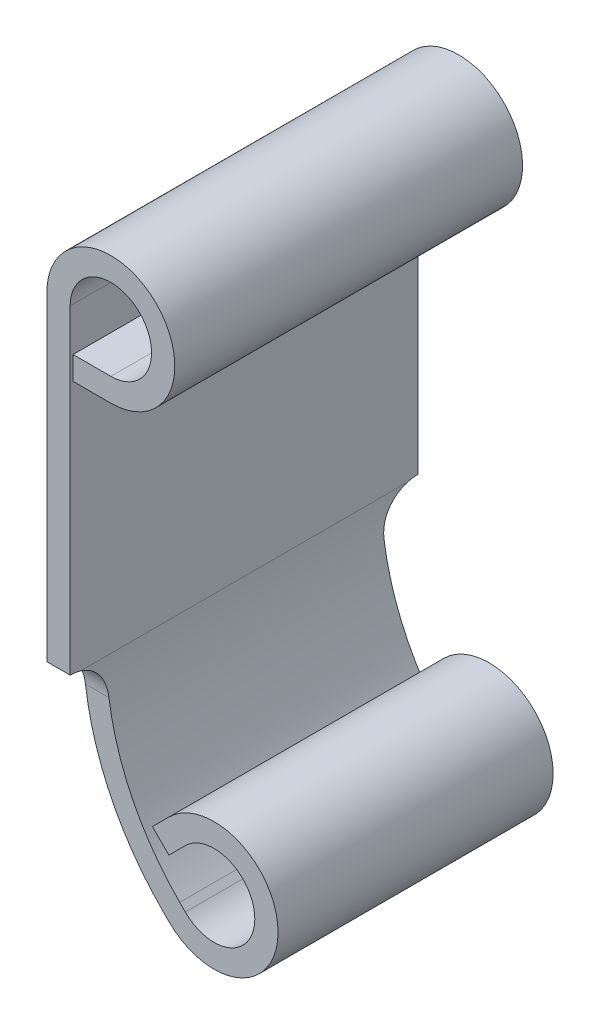
ISO-10303-21;
HEADER;
FILE_DESCRIPTION(('STEP AP214'),'2;1');
FILE_NAME('part.step','',(''),(''),'','','');
FILE_SCHEMA(('AUTOMOTIVE_DESIGN { 1 0 10303 214 1 1 1 1 }'));
ENDSEC;
DATA;
#1=APPLICATION_CONTEXT('core data for automotive mechanical design processes');
#2=APPLICATION_PROTOCOL_DEFINITION('international standard','automotive_design',2000,#1);
#3=PRODUCT_CONTEXT('',#1,'mechanical');
#4=PRODUCT('Part','Part','',(#3));
#5=PRODUCT_RELATED_PRODUCT_CATEGORY('part','',(#4));
#6=PRODUCT_DEFINITION_FORMATION('','',#4);
#7=PRODUCT_DEFINITION_CONTEXT('part definition',#1,'design');
#8=PRODUCT_DEFINITION('design','',#6,#7);
#9=PRODUCT_DEFINITION_SHAPE('','',#8);
#10=(LENGTH_UNIT() NAMED_UNIT(*) SI_UNIT(.MILLI.,.METRE.));
#11=(NAMED_UNIT(*) PLANE_ANGLE_UNIT() SI_UNIT($,.RADIAN.));
#12=(NAMED_UNIT(*) SI_UNIT($,.STERADIAN.) SOLID_ANGLE_UNIT());
#13=UNCERTAINTY_MEASURE_WITH_UNIT(LENGTH_MEASURE(1.E-05),#10,'distance_accuracy_value','');
#14=(GEOMETRIC_REPRESENTATION_CONTEXT(3) GLOBAL_UNCERTAINTY_ASSIGNED_CONTEXT((#13)) GLOBAL_UNIT_ASSIGNED_CONTEXT((#10,
#11,#12)) REPRESENTATION_CONTEXT('',''));
#15=CARTESIAN_POINT('',(0.,0.,0.));
#16=DIRECTION('',(0.,0.,1.));
#17=DIRECTION('',(1.,0.,0.));
#18=AXIS2_PLACEMENT_3D('',#15,#16,#17);
#19=CARTESIAN_POINT('',(-3.29999999999999,-33.4819394424174,-5.98));
#20=DIRECTION('',(0.,0.,1.));
#21=DIRECTION('',(1.,0.,0.));
#22=AXIS2_PLACEMENT_3D('',#19,#20,#21);
#23=PLANE('',#22);
#24=DIRECTION('',(1.,0.,0.));
#25=VECTOR('',#24,1.);
#26=CARTESIAN_POINT('',(-3.29999999999998,-42.2819394424174,-5.98));
#27=LINE('',#26,#25);
#28=CARTESIAN_POINT('',(-5.49999999999998,-42.2819394424174,-5.98));
#29=VERTEX_POINT('',#28);
#30=CARTESIAN_POINT('',(-4.69999999999999,-42.2819394424174,-5.98));
#31=VERTEX_POINT('',#30);
#32=EDGE_CURVE('E186',#29,#31,#27,.T.);
#33=ORIENTED_EDGE('',*,*,#32,.F.);
#34=DIRECTION('',(0.,-1.,0.));
#35=VECTOR('',#34,1.);
#36=CARTESIAN_POINT('',(-5.49999999999998,-31.2819394424174,-5.98));
#37=LINE('',#36,#35);
#38=CARTESIAN_POINT('',(-5.49999999999998,-31.2819394424174,-5.98));
#39=VERTEX_POINT('',#38);
#40=EDGE_CURVE('E490',#39,#29,#37,.T.);
#41=ORIENTED_EDGE('',*,*,#40,.F.);
#42=CARTESIAN_POINT('',(-3.3,-31.2819394424174,-5.98));
#43=DIRECTION('',(0.,0.,1.));
#44=DIRECTION('',(1.,0.,0.));
#45=AXIS2_PLACEMENT_3D('',#42,#43,#44);
#46=CIRCLE('',#45,2.19999999999999);
#47=CARTESIAN_POINT('',(-3.29999999999999,-33.4819394424174,-5.98));
#48=VERTEX_POINT('',#47);
#49=EDGE_CURVE('E577',#48,#39,#46,.T.);
#50=ORIENTED_EDGE('',*,*,#49,.F.);
#51=DIRECTION('',(-1.,0.,0.));
#52=VECTOR('',#51,1.);
#53=CARTESIAN_POINT('',(-3.29999999999999,-33.4819394424174,-5.98));
#54=LINE('',#53,#52);
#55=CARTESIAN_POINT('',(-4.59999999999999,-33.4819394424174,-5.98));
#56=VERTEX_POINT('',#55);
#57=EDGE_CURVE('E554',#48,#56,#54,.T.);
#58=ORIENTED_EDGE('',*,*,#57,.T.);
#59=DIRECTION('',(0.,1.,0.));
#60=VECTOR('',#59,1.);
#61=CARTESIAN_POINT('',(-4.59999999999999,-33.4819394424174,-5.98));
#62=LINE('',#61,#60);
#63=CARTESIAN_POINT('',(-4.60000000000001,-32.6819394424174,-5.98));
#64=VERTEX_POINT('',#63);
#65=EDGE_CURVE('E546',#56,#64,#62,.T.);
#66=ORIENTED_EDGE('',*,*,#65,.T.);
#67=DIRECTION('',(-1.,0.,0.));
#68=VECTOR('',#67,1.);
#69=CARTESIAN_POINT('',(-3.3,-32.6819394424174,-5.98));
#70=LINE('',#69,#68);
#71=CARTESIAN_POINT('',(-3.3,-32.6819394424174,-5.98));
#72=VERTEX_POINT('',#71);
#73=EDGE_CURVE('E570',#72,#64,#70,.T.);
#74=ORIENTED_EDGE('',*,*,#73,.F.);
#75=CARTESIAN_POINT('',(-3.3,-31.2819394424174,-5.98));
#76=DIRECTION('',(0.,0.,1.));
#77=DIRECTION('',(1.,0.,0.));
#78=AXIS2_PLACEMENT_3D('',#75,#76,#77);
#79=CIRCLE('',#78,1.39999999999999);
#80=CARTESIAN_POINT('',(-4.69999999999999,-31.2819394424174,-5.98));
#81=VERTEX_POINT('',#80);
#82=EDGE_CURVE('E189',#72,#81,#79,.T.);
#83=ORIENTED_EDGE('',*,*,#82,.T.);
#84=DIRECTION('',(0.,-1.,0.));
#85=VECTOR('',#84,1.);
#86=CARTESIAN_POINT('',(-4.69999999999999,-31.2819394424174,-5.98));
#87=LINE('',#86,#85);
#88=EDGE_CURVE('E175',#81,#31,#87,.T.);
#89=ORIENTED_EDGE('',*,*,#88,.T.);
#90=EDGE_LOOP('',(#33,#41,#50,#58,#66,#74,#83,#89));
#91=FACE_BOUND('',#90,.T.);
#92=ADVANCED_FACE('F31',(#91),#23,.F.);
#93=CARTESIAN_POINT('',(-1.98873016277921,-46.6276248673667,-5.98));
#94=DIRECTION('',(0.707106781186547,-0.707106781186548,0.));
#95=DIRECTION('',(0.707106781186548,0.707106781186547,0.));
#96=AXIS2_PLACEMENT_3D('',#93,#94,#95);
#97=PLANE('',#96);
#98=DIRECTION('',(-0.707106781186548,-0.707106781186547,0.));
#99=VECTOR('',#98,1.);
#100=CARTESIAN_POINT('',(-1.98873016277921,-46.6276248673667,-4.73));
#101=LINE('',#100,#99);
#102=CARTESIAN_POINT('',(-1.98873016277921,-46.6276248673667,-4.73));
#103=VERTEX_POINT('',#102);
#104=CARTESIAN_POINT('',(-2.55441558772845,-47.1933102923159,-4.73));
#105=VERTEX_POINT('',#104);
#106=EDGE_CURVE('E609',#103,#105,#101,.T.);
#107=ORIENTED_EDGE('',*,*,#106,.F.);
#108=DIRECTION('',(0.,0.,1.));
#109=VECTOR('',#108,1.);
#110=CARTESIAN_POINT('',(-1.98873016277921,-46.6276248673667,-5.98));
#111=LINE('',#110,#109);
#112=CARTESIAN_POINT('',(-1.98873016277921,-46.6276248673667,4.73));
#113=VERTEX_POINT('',#112);
#114=EDGE_CURVE('E506',#103,#113,#111,.T.);
#115=ORIENTED_EDGE('',*,*,#114,.T.);
#116=DIRECTION('',(-0.707106781186548,-0.707106781186547,0.));
#117=VECTOR('',#116,1.);
#118=CARTESIAN_POINT('',(-1.98873016277921,-46.6276248673667,4.73));
#119=LINE('',#118,#117);
#120=CARTESIAN_POINT('',(-2.55441558772845,-47.1933102923159,4.73));
#121=VERTEX_POINT('',#120);
#122=EDGE_CURVE('E521',#113,#121,#119,.T.);
#123=ORIENTED_EDGE('',*,*,#122,.T.);
#124=DIRECTION('',(0.,0.,1.));
#125=VECTOR('',#124,1.);
#126=CARTESIAN_POINT('',(-2.55441558772845,-47.1933102923159,-5.98));
#127=LINE('',#126,#125);
#128=EDGE_CURVE('E510',#105,#121,#127,.T.);
#129=ORIENTED_EDGE('',*,*,#128,.F.);
#130=EDGE_LOOP('',(#107,#115,#123,#129));
#131=FACE_BOUND('',#130,.T.);
#132=ADVANCED_FACE('F226',(#131),#97,.T.);
#133=CARTESIAN_POINT('',(-2.55441558772847,-46.0619394424175,-5.98));
#134=DIRECTION('',(0.707106781186547,-0.707106781186548,0.));
#135=DIRECTION('',(0.707106781186548,0.707106781186547,0.));
#136=AXIS2_PLACEMENT_3D('',#133,#134,#135);
#137=PLANE('',#136);
#138=DIRECTION('',(0.,0.,1.));
#139=VECTOR('',#138,1.);
#140=CARTESIAN_POINT('',(-2.55441558772847,-46.0619394424175,-5.98));
#141=LINE('',#140,#139);
#142=CARTESIAN_POINT('',(-2.55441558772847,-46.0619394424175,-4.73));
#143=VERTEX_POINT('',#142);
#144=CARTESIAN_POINT('',(-2.55441558772847,-46.0619394424175,4.73));
#145=VERTEX_POINT('',#144);
#146=EDGE_CURVE('E504',#143,#145,#141,.T.);
#147=ORIENTED_EDGE('',*,*,#146,.F.);
#148=DIRECTION('',(-0.707106781186548,-0.707106781186547,0.));
#149=VECTOR('',#148,1.);
#150=CARTESIAN_POINT('',(-2.55441558772847,-46.0619394424175,-4.73));
#151=LINE('',#150,#149);
#152=CARTESIAN_POINT('',(-3.1201010126777,-46.6276248673667,-4.73));
#153=VERTEX_POINT('',#152);
#154=EDGE_CURVE('E611',#143,#153,#151,.T.);
#155=ORIENTED_EDGE('',*,*,#154,.T.);
#156=DIRECTION('',(0.,0.,1.));
#157=VECTOR('',#156,1.);
#158=CARTESIAN_POINT('',(-3.12010101267771,-46.6276248673667,-5.98));
#159=LINE('',#158,#157);
#160=CARTESIAN_POINT('',(-3.12010101267771,-46.6276248673667,4.73));
#161=VERTEX_POINT('',#160);
#162=EDGE_CURVE('E508',#153,#161,#159,.T.);
#163=ORIENTED_EDGE('',*,*,#162,.T.);
#164=DIRECTION('',(-0.707106781186548,-0.707106781186547,0.));
#165=VECTOR('',#164,1.);
#166=CARTESIAN_POINT('',(-2.55441558772847,-46.0619394424175,4.73));
#167=LINE('',#166,#165);
#168=EDGE_CURVE('E525',#145,#161,#167,.T.);
#169=ORIENTED_EDGE('',*,*,#168,.F.);
#170=EDGE_LOOP('',(#147,#155,#163,#169));
#171=FACE_BOUND('',#170,.T.);
#172=ADVANCED_FACE('F230',(#171),#137,.F.);
#173=CARTESIAN_POINT('',(-0.998780669118026,-47.6175743610278,0.));
#174=DIRECTION('',(0.,0.,1.));
#175=DIRECTION('',(1.,0.,0.));
#176=AXIS2_PLACEMENT_3D('',#173,#174,#175);
#177=CYLINDRICAL_SURFACE('',#176,1.39999999999999);
#178=CARTESIAN_POINT('',(-0.998780669118026,-47.6175743610278,-4.73));
#179=DIRECTION('',(0.,0.,1.));
#180=DIRECTION('',(1.,0.,0.));
#181=AXIS2_PLACEMENT_3D('',#178,#179,#180);
#182=CIRCLE('',#181,1.39999999999999);
#183=CARTESIAN_POINT('',(-1.98873016277917,-48.607523854689,-4.73));
#184=VERTEX_POINT('',#183);
#185=EDGE_CURVE('E604',#184,#103,#182,.T.);
#186=ORIENTED_EDGE('',*,*,#185,.F.);
#187=DIRECTION('',(0.,0.,1.));
#188=VECTOR('',#187,1.);
#189=CARTESIAN_POINT('',(-1.98873016277917,-48.607523854689,-5.98));
#190=LINE('',#189,#188);
#191=CARTESIAN_POINT('',(-1.98873016277917,-48.607523854689,4.73));
#192=VERTEX_POINT('',#191);
#193=EDGE_CURVE('E502',#184,#192,#190,.T.);
#194=ORIENTED_EDGE('',*,*,#193,.T.);
#195=CARTESIAN_POINT('',(-0.998780669118026,-47.6175743610278,4.73));
#196=DIRECTION('',(0.,0.,1.));
#197=DIRECTION('',(0.,-1.,0.));
#198=AXIS2_PLACEMENT_3D('',#195,#196,#197);
#199=CIRCLE('',#198,1.39999999999999);
#200=EDGE_CURVE('E530',#192,#113,#199,.T.);
#201=ORIENTED_EDGE('',*,*,#200,.T.);
#202=ORIENTED_EDGE('',*,*,#114,.F.);
#203=EDGE_LOOP('',(#186,#194,#201,#202));
#204=FACE_BOUND('',#203,.T.);
#205=ADVANCED_FACE('F234',(#204),#177,.F.);
#206=CARTESIAN_POINT('',(-0.998780669118026,-47.6175743610278,0.));
#207=DIRECTION('',(0.,0.,1.));
#208=DIRECTION('',(1.,0.,0.));
#209=AXIS2_PLACEMENT_3D('',#206,#207,#208);
#210=CYLINDRICAL_SURFACE('',#209,2.19999999999999);
#211=DIRECTION('',(0.,0.,1.));
#212=VECTOR('',#211,1.);
#213=CARTESIAN_POINT('',(-2.55441558772839,-49.1732092796382,-5.98));
#214=LINE('',#213,#212);
#215=CARTESIAN_POINT('',(-2.55441558772839,-49.1732092796382,-4.73));
#216=VERTEX_POINT('',#215);
#217=CARTESIAN_POINT('',(-2.55441558772839,-49.1732092796382,4.73));
#218=VERTEX_POINT('',#217);
#219=EDGE_CURVE('E500',#216,#218,#214,.T.);
#220=ORIENTED_EDGE('',*,*,#219,.F.);
#221=CARTESIAN_POINT('',(-0.998780669118026,-47.6175743610278,-4.73));
#222=DIRECTION('',(0.,0.,1.));
#223=DIRECTION('',(1.,0.,0.));
#224=AXIS2_PLACEMENT_3D('',#221,#222,#223);
#225=CIRCLE('',#224,2.19999999999999);
#226=EDGE_CURVE('E606',#216,#143,#225,.T.);
#227=ORIENTED_EDGE('',*,*,#226,.T.);
#228=ORIENTED_EDGE('',*,*,#146,.T.);
#229=CARTESIAN_POINT('',(-0.998780669118026,-47.6175743610278,4.73));
#230=DIRECTION('',(0.,0.,1.));
#231=DIRECTION('',(0.,-1.,0.));
#232=AXIS2_PLACEMENT_3D('',#229,#230,#231);
#233=CIRCLE('',#232,2.19999999999999);
#234=EDGE_CURVE('E528',#218,#145,#233,.T.);
#235=ORIENTED_EDGE('',*,*,#234,.F.);
#236=EDGE_LOOP('',(#220,#227,#228,#235));
#237=FACE_BOUND('',#236,.T.);
#238=ADVANCED_FACE('F238',(#237),#210,.T.);
#239=CARTESIAN_POINT('',(-2.18111831820427,-48.4151356992639,-5.98));
#240=DIRECTION('',(0.707106781186568,0.707106781186528,0.));
#241=DIRECTION('',(-0.707106781186528,0.707106781186568,0.));
#242=AXIS2_PLACEMENT_3D('',#239,#240,#241);
#243=PLANE('',#242);
#244=DIRECTION('',(0.707106781186528,-0.707106781186568,0.));
#245=VECTOR('',#244,1.);
#246=CARTESIAN_POINT('',(-2.18111831820427,-48.4151356992639,-4.73));
#247=LINE('',#246,#245);
#248=CARTESIAN_POINT('',(-2.18111831820427,-48.4151356992639,-4.73));
#249=VERTEX_POINT('',#248);
#250=EDGE_CURVE('E599',#249,#184,#247,.T.);
#251=ORIENTED_EDGE('',*,*,#250,.F.);
#252=DIRECTION('',(0.,0.,1.));
#253=VECTOR('',#252,1.);
#254=CARTESIAN_POINT('',(-2.18111831820427,-48.4151356992639,-5.98));
#255=LINE('',#254,#253);
#256=CARTESIAN_POINT('',(-2.18111831820427,-48.4151356992639,4.73));
#257=VERTEX_POINT('',#256);
#258=EDGE_CURVE('E497',#249,#257,#255,.T.);
#259=ORIENTED_EDGE('',*,*,#258,.T.);
#260=DIRECTION('',(0.707106781186528,-0.707106781186568,0.));
#261=VECTOR('',#260,1.);
#262=CARTESIAN_POINT('',(-2.18111831820428,-48.4151356992639,4.73));
#263=LINE('',#262,#261);
#264=EDGE_CURVE('E540',#257,#192,#263,.T.);
#265=ORIENTED_EDGE('',*,*,#264,.T.);
#266=ORIENTED_EDGE('',*,*,#193,.F.);
#267=EDGE_LOOP('',(#251,#259,#265,#266));
#268=FACE_BOUND('',#267,.T.);
#269=ADVANCED_FACE('F242',(#268),#243,.T.);
#270=CARTESIAN_POINT('',(-2.7468037431535,-48.9808211242131,-5.98));
#271=DIRECTION('',(0.707106781186568,0.707106781186528,0.));
#272=DIRECTION('',(-0.707106781186528,0.707106781186568,0.));
#273=AXIS2_PLACEMENT_3D('',#270,#271,#272);
#274=PLANE('',#273);
#275=DIRECTION('',(0.,0.,1.));
#276=VECTOR('',#275,1.);
#277=CARTESIAN_POINT('',(-2.7468037431535,-48.9808211242131,-5.98));
#278=LINE('',#277,#276);
#279=CARTESIAN_POINT('',(-2.7468037431535,-48.9808211242131,-4.73));
#280=VERTEX_POINT('',#279);
#281=CARTESIAN_POINT('',(-2.7468037431535,-48.9808211242131,4.73));
#282=VERTEX_POINT('',#281);
#283=EDGE_CURVE('E190',#280,#282,#278,.T.);
#284=ORIENTED_EDGE('',*,*,#283,.F.);
#285=DIRECTION('',(0.707106781186528,-0.707106781186568,0.));
#286=VECTOR('',#285,1.);
#287=CARTESIAN_POINT('',(-2.7468037431535,-48.9808211242131,-4.73));
#288=LINE('',#287,#286);
#289=EDGE_CURVE('E597',#280,#216,#288,.T.);
#290=ORIENTED_EDGE('',*,*,#289,.T.);
#291=ORIENTED_EDGE('',*,*,#219,.T.);
#292=DIRECTION('',(0.707106781186528,-0.707106781186568,0.));
#293=VECTOR('',#292,1.);
#294=CARTESIAN_POINT('',(-2.7468037431535,-48.9808211242131,4.73));
#295=LINE('',#294,#293);
#296=EDGE_CURVE('E537',#282,#218,#295,.T.);
#297=ORIENTED_EDGE('',*,*,#296,.F.);
#298=EDGE_LOOP('',(#284,#290,#291,#297));
#299=FACE_BOUND('',#298,.T.);
#300=ADVANCED_FACE('F246',(#299),#274,.F.);
#301=CARTESIAN_POINT('',(3.9,-42.3340173810595,0.));
#302=DIRECTION('',(0.,0.,1.));
#303=DIRECTION('',(1.,0.,0.));
#304=AXIS2_PLACEMENT_3D('',#301,#302,#303);
#305=CYLINDRICAL_SURFACE('',#304,8.59999999999999);
#306=CARTESIAN_POINT('',(3.9,-42.3340173810595,-4.73));
#307=DIRECTION('',(0.,0.,1.));
#308=DIRECTION('',(1.,0.,0.));
#309=AXIS2_PLACEMENT_3D('',#306,#307,#308);
#310=CIRCLE('',#309,8.59999999999999);
#311=CARTESIAN_POINT('',(-4.61616009331153,-43.5319394424174,-4.73));
#312=VERTEX_POINT('',#311);
#313=EDGE_CURVE('E532',#312,#249,#310,.T.);
#314=ORIENTED_EDGE('',*,*,#313,.F.);
#315=CARTESIAN_POINT('',(-4.61616009331153,-43.5319394424174,-4.73));
#316=CARTESIAN_POINT('',(-4.62104993828591,-43.4971852873352,-4.73000021214259));
#317=CARTESIAN_POINT('',(-4.62572227706097,-43.4624164564649,-4.73145041955103));
#318=CARTESIAN_POINT('',(-4.63461435122024,-43.3930629631632,-4.73725079006692));
#319=CARTESIAN_POINT('',(-4.63883407938238,-43.3584783036789,-4.74160099944015));
#320=CARTESIAN_POINT('',(-4.65077731516905,-43.2554124747046,-4.75898633879174));
#321=CARTESIAN_POINT('',(-4.65779775424165,-43.187527437024,-4.77635619077868));
#322=CARTESIAN_POINT('',(-4.6699448542798,-43.0554464215857,-4.82226392659528));
#323=CARTESIAN_POINT('',(-4.6750701442369,-42.9912531427982,-4.85080986492932));
#324=CARTESIAN_POINT('',(-4.68359707255082,-42.8684776225537,-4.91829367252971));
#325=CARTESIAN_POINT('',(-4.6869993582717,-42.8098932804362,-4.95722763042071));
#326=CARTESIAN_POINT('',(-4.69237109550727,-42.7002998997159,-5.04418593573854));
#327=CARTESIAN_POINT('',(-4.69434721760826,-42.6492564940415,-5.09216662117558));
#328=CARTESIAN_POINT('',(-4.697265264186,-42.5558632785398,-5.19600367389916));
#329=CARTESIAN_POINT('',(-4.69820706749208,-42.5135144877609,-5.25186096306681));
#330=CARTESIAN_POINT('',(-4.69933397685407,-42.4454181480997,-5.35930387979101));
#331=CARTESIAN_POINT('',(-4.6996240667332,-42.4180568840554,-5.40987518833364));
#332=CARTESIAN_POINT('',(-4.69995342039199,-42.3705362908953,-5.51423151939748));
#333=CARTESIAN_POINT('',(-4.6999929457928,-42.3503694706436,-5.56801313068863));
#334=CARTESIAN_POINT('',(-4.69999999999999,-42.3340173810602,-5.62295275534797));
#335=B_SPLINE_CURVE_WITH_KNOTS('',3,(#315,#316,#317,#318,#319,#320,#321,#322,#323,#324,#325,
#326,#327,#328,#329,#330,#331,#332,#333,#334),.UNSPECIFIED.,.F.,.F.,(4,2,2,2,2,2,2,2,2,4),(0.,
0.105226819044401,0.210455316886367,0.420637092755744,0.6309706243947,0.841225071158929,
1.05048960765263,1.25977865691849,1.4317487489792,1.60353925280753),.UNSPECIFIED.);
#336=CARTESIAN_POINT('',(-4.69999999999998,-42.3340173810596,-5.62295275534758));
#337=VERTEX_POINT('',#336);
#338=EDGE_CURVE('E181',#312,#337,#335,.T.);
#339=ORIENTED_EDGE('',*,*,#338,.T.);
#340=DIRECTION('',(0.,0.,1.));
#341=VECTOR('',#340,1.);
#342=CARTESIAN_POINT('',(-4.69999999999998,-42.3340173810596,-5.98));
#343=LINE('',#342,#341);
#344=CARTESIAN_POINT('',(-4.69999999999998,-42.3340173810596,5.62295275534758));
#345=VERTEX_POINT('',#344);
#346=EDGE_CURVE('E50',#337,#345,#343,.T.);
#347=ORIENTED_EDGE('',*,*,#346,.T.);
#348=CARTESIAN_POINT('',(-4.69999999999998,-42.3340173810596,5.62295275534758));
#349=CARTESIAN_POINT('',(-4.69999896984181,-42.3440467758353,5.58930420985432));
#350=CARTESIAN_POINT('',(-4.69998251217419,-42.3554895365009,5.55609443730486));
#351=CARTESIAN_POINT('',(-4.69988076492231,-42.3811254798105,5.49075558258808));
#352=CARTESIAN_POINT('',(-4.69979547786382,-42.3953185615146,5.45862646081037));
#353=CARTESIAN_POINT('',(-4.69937974929133,-42.4418722934562,5.36423774400827));
#354=CARTESIAN_POINT('',(-4.69888962241867,-42.4782322191111,5.30389391881556));
#355=CARTESIAN_POINT('',(-4.69711417848655,-42.560549455515,5.19016566730561));
#356=CARTESIAN_POINT('',(-4.69582847246832,-42.6065114534336,5.1367846605771));
#357=CARTESIAN_POINT('',(-4.69206697346365,-42.7066978430134,5.03851480547164));
#358=CARTESIAN_POINT('',(-4.68959165274193,-42.7609189500643,4.99362259697612));
#359=CARTESIAN_POINT('',(-4.68310356340903,-42.8758980705384,4.91369757916631));
#360=CARTESIAN_POINT('',(-4.67909482262628,-42.9366386610743,4.87863935363578));
#361=CARTESIAN_POINT('',(-4.66928046649219,-43.0630210319571,4.81918525274701));
#362=CARTESIAN_POINT('',(-4.66347462571153,-43.128663426405,4.79479071597494));
#363=CARTESIAN_POINT('',(-4.65119581265196,-43.2505734646554,4.76074929495946));
#364=CARTESIAN_POINT('',(-4.64503966721363,-43.3063567627667,4.74921989334364));
#365=CARTESIAN_POINT('',(-4.63150561562947,-43.4187635781341,4.73383791464321));
#366=CARTESIAN_POINT('',(-4.62412904968312,-43.475386112367,4.7299769762937));
#367=CARTESIAN_POINT('',(-4.61616009331153,-43.5319394424174,4.73));
#368=B_SPLINE_CURVE_WITH_KNOTS('',3,(#348,#349,#350,#351,#352,#353,#354,#355,#356,#357,#358,
#359,#360,#361,#362,#363,#364,#365,#366,#367),.UNSPECIFIED.,.F.,.F.,(4,2,2,2,2,2,2,2,2,4),(0.,
0.105269772666643,0.210535682538854,0.420811278703959,0.631189759952247,0.841484792025171,
1.0512311945167,1.26100391839391,1.43236495028479,1.60353903686256),.UNSPECIFIED.);
#369=CARTESIAN_POINT('',(-4.61616009331153,-43.5319394424174,4.73));
#370=VERTEX_POINT('',#369);
#371=EDGE_CURVE('E12',#345,#370,#368,.T.);
#372=ORIENTED_EDGE('',*,*,#371,.T.);
#373=CARTESIAN_POINT('',(3.9,-42.3340173810595,4.73));
#374=DIRECTION('',(0.,0.,1.));
#375=DIRECTION('',(0.,-1.,0.));
#376=AXIS2_PLACEMENT_3D('',#373,#374,#375);
#377=CIRCLE('',#376,8.59999999999999);
#378=EDGE_CURVE('E544',#370,#257,#377,.T.);
#379=ORIENTED_EDGE('',*,*,#378,.T.);
#380=ORIENTED_EDGE('',*,*,#258,.F.);
#381=EDGE_LOOP('',(#314,#339,#347,#372,#379,#380));
#382=FACE_BOUND('',#381,.T.);
#383=ADVANCED_FACE('F249',(#382),#305,.F.);
#384=CARTESIAN_POINT('',(3.9,-42.3340173810595,0.));
#385=DIRECTION('',(0.,0.,1.));
#386=DIRECTION('',(1.,0.,0.));
#387=AXIS2_PLACEMENT_3D('',#384,#385,#386);
#388=CYLINDRICAL_SURFACE('',#387,9.39999999999998);
#389=DIRECTION('',(0.,0.,1.));
#390=VECTOR('',#389,1.);
#391=CARTESIAN_POINT('',(-5.49999999999998,-42.3340173810596,-5.98));
#392=LINE('',#391,#390);
#393=CARTESIAN_POINT('',(-5.49999999999998,-42.3340173810596,-5.62295275534751));
#394=VERTEX_POINT('',#393);
#395=CARTESIAN_POINT('',(-5.49999999999998,-42.3340173810596,5.62295275534751));
#396=VERTEX_POINT('',#395);
#397=EDGE_CURVE('E58',#394,#396,#392,.T.);
#398=ORIENTED_EDGE('',*,*,#397,.F.);
#399=CARTESIAN_POINT('',(-5.49999999999998,-42.3340173810596,-5.62295275534751));
#400=CARTESIAN_POINT('',(-5.49999905661126,-42.3440492392555,-5.58929594034764));
#401=CARTESIAN_POINT('',(-5.49998399261306,-42.3554951589282,-5.55607811827434));
#402=CARTESIAN_POINT('',(-5.49989085168055,-42.3811387355255,-5.49072379004687));
#403=CARTESIAN_POINT('',(-5.49981277716354,-42.3953362868727,-5.45858724246079));
#404=CARTESIAN_POINT('',(-5.49943220214168,-42.4419042762644,-5.36417943813982));
#405=CARTESIAN_POINT('',(-5.49898352145647,-42.4782755327428,-5.30382482024347));
#406=CARTESIAN_POINT('',(-5.49735821704836,-42.5606193692811,-5.19007836269852));
#407=CARTESIAN_POINT('',(-5.49618124675229,-42.6065965136176,-5.13668985268583));
#408=CARTESIAN_POINT('',(-5.4927378632681,-42.7068208609449,-5.03840552678773));
#409=CARTESIAN_POINT('',(-5.4904718579031,-42.7610649629272,-4.99350654049893));
#410=CARTESIAN_POINT('',(-5.48453098034495,-42.8761284357806,-4.91355202379635));
#411=CARTESIAN_POINT('',(-5.48085916842797,-42.936933319541,-4.87847539643718));
#412=CARTESIAN_POINT('',(-5.47186858540614,-43.0634684352975,-4.81900026254848));
#413=CARTESIAN_POINT('',(-5.46654964501703,-43.1291991730236,-4.79460285420213));
#414=CARTESIAN_POINT('',(-5.45531832048159,-43.2510920432886,-4.76063596632717));
#415=CARTESIAN_POINT('',(-5.4497007832698,-43.3067572973084,-4.74915153432201));
#416=CARTESIAN_POINT('',(-5.43735346990106,-43.4189468300615,-4.73382650215751));
#417=CARTESIAN_POINT('',(-5.43062490670433,-43.4754701115989,-4.72997762488849));
#418=CARTESIAN_POINT('',(-5.42335683833412,-43.5319394424174,-4.73));
#419=B_SPLINE_CURVE_WITH_KNOTS('',3,(#399,#400,#401,#402,#403,#404,#405,#406,#407,#408,#409,
#410,#411,#412,#413,#414,#415,#416,#417,#418),.UNSPECIFIED.,.F.,.F.,(4,2,2,2,2,2,2,2,2,4),(0.,
0.105295616912872,0.210587194538839,0.420906951999539,0.631326871952451,0.841668054936537,
1.05155392958767,1.26146138250427,1.43228914775261,1.60293163052857),.UNSPECIFIED.);
#420=CARTESIAN_POINT('',(-5.42335683833413,-43.5319394424174,-4.73));
#421=VERTEX_POINT('',#420);
#422=EDGE_CURVE('E210',#394,#421,#419,.T.);
#423=ORIENTED_EDGE('',*,*,#422,.T.);
#424=CARTESIAN_POINT('',(3.9,-42.3340173810595,-4.73));
#425=DIRECTION('',(0.,0.,1.));
#426=DIRECTION('',(1.,0.,0.));
#427=AXIS2_PLACEMENT_3D('',#424,#425,#426);
#428=CIRCLE('',#427,9.39999999999998);
#429=EDGE_CURVE('E594',#421,#280,#428,.T.);
#430=ORIENTED_EDGE('',*,*,#429,.T.);
#431=ORIENTED_EDGE('',*,*,#283,.T.);
#432=CARTESIAN_POINT('',(3.9,-42.3340173810595,4.73));
#433=DIRECTION('',(0.,0.,1.));
#434=DIRECTION('',(0.,-1.,0.));
#435=AXIS2_PLACEMENT_3D('',#432,#433,#434);
#436=CIRCLE('',#435,9.39999999999998);
#437=CARTESIAN_POINT('',(-5.42335683833413,-43.5319394424174,4.73));
#438=VERTEX_POINT('',#437);
#439=EDGE_CURVE('E482',#438,#282,#436,.T.);
#440=ORIENTED_EDGE('',*,*,#439,.F.);
#441=CARTESIAN_POINT('',(-5.42335683833413,-43.5319394424174,4.73));
#442=CARTESIAN_POINT('',(-5.42783194279368,-43.4971183204976,4.73000021631504));
#443=CARTESIAN_POINT('',(-5.43210757519307,-43.462287637918,4.73145600064782));
#444=CARTESIAN_POINT('',(-5.44024381151267,-43.3928213550807,4.73727622324138));
#445=CARTESIAN_POINT('',(-5.4441044130131,-43.3581857559615,4.74164067845971));
#446=CARTESIAN_POINT('',(-5.45502979369463,-43.2549849007542,4.75907785904926));
#447=CARTESIAN_POINT('',(-5.46145011232919,-43.1870320164946,4.77649442339107));
#448=CARTESIAN_POINT('',(-5.47255598999336,-43.0548564167103,4.82250330879005));
#449=CARTESIAN_POINT('',(-5.47724038136731,-42.9906362363487,4.85110312568028));
#450=CARTESIAN_POINT('',(-5.48503204479835,-42.8678326591938,4.91869442688992));
#451=CARTESIAN_POINT('',(-5.48813987877363,-42.8092472600879,4.95768220115544));
#452=CARTESIAN_POINT('',(-5.4930472350131,-42.6996267131875,5.04477858255361));
#453=CARTESIAN_POINT('',(-5.49485184290047,-42.6485628421595,5.09285080169649));
#454=CARTESIAN_POINT('',(-5.49751472850571,-42.5551571622251,5.19687708299666));
#455=CARTESIAN_POINT('',(-5.49837291569745,-42.5128161879876,5.2528318985553));
#456=CARTESIAN_POINT('',(-5.49939621676439,-42.444902930324,5.36022598304194));
#457=CARTESIAN_POINT('',(-5.49965910538936,-42.4176810277151,5.41063105009592));
#458=CARTESIAN_POINT('',(-5.49995769400112,-42.3703881535428,5.51462735494816));
#459=CARTESIAN_POINT('',(-5.49999363113441,-42.3503097383119,5.5682152078428));
#460=CARTESIAN_POINT('',(-5.49999999999998,-42.3340173810602,5.6229527553479));
#461=B_SPLINE_CURVE_WITH_KNOTS('',3,(#441,#442,#443,#444,#445,#446,#447,#448,#449,#450,#451,
#452,#453,#454,#455,#456,#457,#458,#459,#460),.UNSPECIFIED.,.F.,.F.,(4,2,2,2,2,2,2,2,2,4),(0.,
0.105259590519127,0.210519794707271,0.420760789105645,0.631142944605037,0.841450062705028,
1.0509319910769,1.26043395487489,1.43177242978033,1.60293183976006),.UNSPECIFIED.);
#462=EDGE_CURVE('E180',#438,#396,#461,.T.);
#463=ORIENTED_EDGE('',*,*,#462,.T.);
#464=EDGE_LOOP('',(#398,#423,#430,#431,#440,#463));
#465=FACE_BOUND('',#464,.T.);
#466=ADVANCED_FACE('F219',(#465),#388,.T.);
#467=CARTESIAN_POINT('',(-4.69999999999999,-31.2819394424174,-5.98));
#468=DIRECTION('',(1.,0.,0.));
#469=DIRECTION('',(0.,1.,0.));
#470=AXIS2_PLACEMENT_3D('',#467,#468,#469);
#471=PLANE('',#470);
#472=ORIENTED_EDGE('',*,*,#346,.F.);
#473=CARTESIAN_POINT('',(-4.69999999999998,-43.5319394424174,-5.98));
#474=DIRECTION('',(1.,0.,0.));
#475=DIRECTION('',(0.,1.,0.));
#476=AXIS2_PLACEMENT_3D('',#473,#474,#475);
#477=CIRCLE('',#476,1.25);
#478=EDGE_CURVE('E171',#337,#31,#477,.F.);
#479=ORIENTED_EDGE('',*,*,#478,.T.);
#480=ORIENTED_EDGE('',*,*,#88,.F.);
#481=DIRECTION('',(0.,0.,1.));
#482=VECTOR('',#481,1.);
#483=CARTESIAN_POINT('',(-4.69999999999999,-31.2819394424174,-5.98));
#484=LINE('',#483,#482);
#485=CARTESIAN_POINT('',(-4.69999999999999,-31.2819394424174,5.98));
#486=VERTEX_POINT('',#485);
#487=EDGE_CURVE('E575',#81,#486,#484,.T.);
#488=ORIENTED_EDGE('',*,*,#487,.T.);
#489=DIRECTION('',(0.,-1.,0.));
#490=VECTOR('',#489,1.);
#491=CARTESIAN_POINT('',(-4.69999999999999,-31.2819394424174,5.98));
#492=LINE('',#491,#490);
#493=CARTESIAN_POINT('',(-4.69999999999999,-42.2819394424174,5.98));
#494=VERTEX_POINT('',#493);
#495=EDGE_CURVE('E191',#486,#494,#492,.T.);
#496=ORIENTED_EDGE('',*,*,#495,.T.);
#497=CARTESIAN_POINT('',(-4.69999999999998,-43.5319394424174,5.98));
#498=DIRECTION('',(1.,0.,0.));
#499=DIRECTION('',(0.,1.,0.));
#500=AXIS2_PLACEMENT_3D('',#497,#498,#499);
#501=CIRCLE('',#500,1.25);
#502=EDGE_CURVE('E44',#494,#345,#501,.F.);
#503=ORIENTED_EDGE('',*,*,#502,.T.);
#504=EDGE_LOOP('',(#472,#479,#480,#488,#496,#503));
#505=FACE_BOUND('',#504,.T.);
#506=ADVANCED_FACE('F173',(#505),#471,.T.);
#507=CARTESIAN_POINT('',(-5.49999999999998,-31.2819394424174,-5.98));
#508=DIRECTION('',(1.,0.,0.));
#509=DIRECTION('',(0.,1.,0.));
#510=AXIS2_PLACEMENT_3D('',#507,#508,#509);
#511=PLANE('',#510);
#512=ORIENTED_EDGE('',*,*,#40,.T.);
#513=CARTESIAN_POINT('',(-5.49999999999998,-43.5319394424174,-5.98));
#514=DIRECTION('',(1.,0.,0.));
#515=DIRECTION('',(0.,1.,0.));
#516=AXIS2_PLACEMENT_3D('',#513,#514,#515);
#517=CIRCLE('',#516,1.25);
#518=EDGE_CURVE('E195',#29,#394,#517,.T.);
#519=ORIENTED_EDGE('',*,*,#518,.T.);
#520=ORIENTED_EDGE('',*,*,#397,.T.);
#521=CARTESIAN_POINT('',(-5.49999999999998,-43.5319394424174,5.98));
#522=DIRECTION('',(1.,0.,0.));
#523=DIRECTION('',(0.,1.,0.));
#524=AXIS2_PLACEMENT_3D('',#521,#522,#523);
#525=CIRCLE('',#524,1.25);
#526=CARTESIAN_POINT('',(-5.49999999999998,-42.2819394424174,5.98));
#527=VERTEX_POINT('',#526);
#528=EDGE_CURVE('E474',#396,#527,#525,.T.);
#529=ORIENTED_EDGE('',*,*,#528,.T.);
#530=DIRECTION('',(0.,-1.,0.));
#531=VECTOR('',#530,1.);
#532=CARTESIAN_POINT('',(-5.49999999999998,-31.2819394424174,5.98));
#533=LINE('',#532,#531);
#534=CARTESIAN_POINT('',(-5.49999999999998,-31.2819394424174,5.98));
#535=VERTEX_POINT('',#534);
#536=EDGE_CURVE('E485',#535,#527,#533,.T.);
#537=ORIENTED_EDGE('',*,*,#536,.F.);
#538=DIRECTION('',(0.,0.,1.));
#539=VECTOR('',#538,1.);
#540=CARTESIAN_POINT('',(-5.49999999999998,-31.2819394424174,-5.98));
#541=LINE('',#540,#539);
#542=EDGE_CURVE('E573',#39,#535,#541,.T.);
#543=ORIENTED_EDGE('',*,*,#542,.F.);
#544=EDGE_LOOP('',(#512,#519,#520,#529,#537,#543));
#545=FACE_BOUND('',#544,.T.);
#546=ADVANCED_FACE('F276',(#545),#511,.F.);
#547=CARTESIAN_POINT('',(-3.29999999999999,-33.4819394424174,5.98));
#548=DIRECTION('',(0.,0.,1.));
#549=DIRECTION('',(1.,0.,0.));
#550=AXIS2_PLACEMENT_3D('',#547,#548,#549);
#551=PLANE('',#550);
#552=ORIENTED_EDGE('',*,*,#536,.T.);
#553=DIRECTION('',(1.,0.,0.));
#554=VECTOR('',#553,1.);
#555=CARTESIAN_POINT('',(-3.29999999999998,-42.2819394424174,5.98));
#556=LINE('',#555,#554);
#557=EDGE_CURVE('E197',#527,#494,#556,.T.);
#558=ORIENTED_EDGE('',*,*,#557,.T.);
#559=ORIENTED_EDGE('',*,*,#495,.F.);
#560=CARTESIAN_POINT('',(-3.3,-31.2819394424174,5.98));
#561=DIRECTION('',(0.,0.,1.));
#562=DIRECTION('',(1.,0.,0.));
#563=AXIS2_PLACEMENT_3D('',#560,#561,#562);
#564=CIRCLE('',#563,1.39999999999999);
#565=CARTESIAN_POINT('',(-3.3,-32.6819394424174,5.98));
#566=VERTEX_POINT('',#565);
#567=EDGE_CURVE('E581',#566,#486,#564,.T.);
#568=ORIENTED_EDGE('',*,*,#567,.F.);
#569=DIRECTION('',(-1.,0.,0.));
#570=VECTOR('',#569,1.);
#571=CARTESIAN_POINT('',(-3.3,-32.6819394424174,5.98));
#572=LINE('',#571,#570);
#573=CARTESIAN_POINT('',(-4.60000000000001,-32.6819394424174,5.98));
#574=VERTEX_POINT('',#573);
#575=EDGE_CURVE('E568',#566,#574,#572,.T.);
#576=ORIENTED_EDGE('',*,*,#575,.T.);
#577=DIRECTION('',(0.,1.,0.));
#578=VECTOR('',#577,1.);
#579=CARTESIAN_POINT('',(-4.59999999999999,-33.4819394424174,5.98));
#580=LINE('',#579,#578);
#581=CARTESIAN_POINT('',(-4.59999999999999,-33.4819394424174,5.98));
#582=VERTEX_POINT('',#581);
#583=EDGE_CURVE('E560',#582,#574,#580,.T.);
#584=ORIENTED_EDGE('',*,*,#583,.F.);
#585=DIRECTION('',(-1.,0.,0.));
#586=VECTOR('',#585,1.);
#587=CARTESIAN_POINT('',(-3.29999999999999,-33.4819394424174,5.98));
#588=LINE('',#587,#586);
#589=CARTESIAN_POINT('',(-3.29999999999999,-33.4819394424174,5.98));
#590=VERTEX_POINT('',#589);
#591=EDGE_CURVE('E566',#590,#582,#588,.T.);
#592=ORIENTED_EDGE('',*,*,#591,.F.);
#593=CARTESIAN_POINT('',(-3.3,-31.2819394424174,5.98));
#594=DIRECTION('',(0.,0.,1.));
#595=DIRECTION('',(1.,0.,0.));
#596=AXIS2_PLACEMENT_3D('',#593,#594,#595);
#597=CIRCLE('',#596,2.19999999999999);
#598=EDGE_CURVE('E489',#590,#535,#597,.T.);
#599=ORIENTED_EDGE('',*,*,#598,.T.);
#600=EDGE_LOOP('',(#552,#558,#559,#568,#576,#584,#592,#599));
#601=FACE_BOUND('',#600,.T.);
#602=ADVANCED_FACE('F278',(#601),#551,.T.);
#603=CARTESIAN_POINT('',(-2.55441558772845,-47.1933102923159,-5.98));
#604=DIRECTION('',(-0.707106781186525,-0.70710678118657,0.));
#605=DIRECTION('',(0.70710678118657,-0.707106781186525,0.));
#606=AXIS2_PLACEMENT_3D('',#603,#604,#605);
#607=PLANE('',#606);
#608=DIRECTION('',(-0.70710678118657,0.707106781186525,0.));
#609=VECTOR('',#608,1.);
#610=CARTESIAN_POINT('',(-2.55441558772845,-47.1933102923159,-4.73));
#611=LINE('',#610,#609);
#612=EDGE_CURVE('E196',#105,#153,#611,.T.);
#613=ORIENTED_EDGE('',*,*,#612,.F.);
#614=ORIENTED_EDGE('',*,*,#128,.T.);
#615=DIRECTION('',(-0.70710678118657,0.707106781186525,0.));
#616=VECTOR('',#615,1.);
#617=CARTESIAN_POINT('',(-2.55441558772845,-47.1933102923159,4.73));
#618=LINE('',#617,#616);
#619=EDGE_CURVE('E201',#121,#161,#618,.T.);
#620=ORIENTED_EDGE('',*,*,#619,.T.);
#621=ORIENTED_EDGE('',*,*,#162,.F.);
#622=EDGE_LOOP('',(#613,#614,#620,#621));
#623=FACE_BOUND('',#622,.T.);
#624=ADVANCED_FACE('F274',(#623),#607,.T.);
#625=CARTESIAN_POINT('',(-3.3,-31.2819394424174,0.));
#626=DIRECTION('',(0.,0.,1.));
#627=DIRECTION('',(1.,0.,0.));
#628=AXIS2_PLACEMENT_3D('',#625,#626,#627);
#629=CYLINDRICAL_SURFACE('',#628,1.39999999999999);
#630=DIRECTION('',(0.,0.,1.));
#631=VECTOR('',#630,1.);
#632=CARTESIAN_POINT('',(-3.3,-32.6819394424174,-5.98));
#633=LINE('',#632,#631);
#634=EDGE_CURVE('E547',#72,#566,#633,.T.);
#635=ORIENTED_EDGE('',*,*,#634,.T.);
#636=ORIENTED_EDGE('',*,*,#567,.T.);
#637=ORIENTED_EDGE('',*,*,#487,.F.);
#638=ORIENTED_EDGE('',*,*,#82,.F.);
#639=EDGE_LOOP('',(#635,#636,#637,#638));
#640=FACE_BOUND('',#639,.T.);
#641=ADVANCED_FACE('F270',(#640),#629,.F.);
#642=CARTESIAN_POINT('',(-3.3,-31.2819394424174,0.));
#643=DIRECTION('',(0.,0.,1.));
#644=DIRECTION('',(1.,0.,0.));
#645=AXIS2_PLACEMENT_3D('',#642,#643,#644);
#646=CYLINDRICAL_SURFACE('',#645,2.19999999999999);
#647=DIRECTION('',(0.,0.,1.));
#648=VECTOR('',#647,1.);
#649=CARTESIAN_POINT('',(-3.29999999999999,-33.4819394424174,-5.98));
#650=LINE('',#649,#648);
#651=EDGE_CURVE('E550',#48,#590,#650,.T.);
#652=ORIENTED_EDGE('',*,*,#651,.F.);
#653=ORIENTED_EDGE('',*,*,#49,.T.);
#654=ORIENTED_EDGE('',*,*,#542,.T.);
#655=ORIENTED_EDGE('',*,*,#598,.F.);
#656=EDGE_LOOP('',(#652,#653,#654,#655));
#657=FACE_BOUND('',#656,.T.);
#658=ADVANCED_FACE('F267',(#657),#646,.T.);
#659=CARTESIAN_POINT('',(-3.3,-32.6819394424174,-5.98));
#660=DIRECTION('',(0.,-1.,0.));
#661=DIRECTION('',(1.,0.,0.));
#662=AXIS2_PLACEMENT_3D('',#659,#660,#661);
#663=PLANE('',#662);
#664=DIRECTION('',(0.,0.,1.));
#665=VECTOR('',#664,1.);
#666=CARTESIAN_POINT('',(-4.60000000000001,-32.6819394424174,-5.98));
#667=LINE('',#666,#665);
#668=EDGE_CURVE('E557',#64,#574,#667,.T.);
#669=ORIENTED_EDGE('',*,*,#668,.T.);
#670=ORIENTED_EDGE('',*,*,#575,.F.);
#671=ORIENTED_EDGE('',*,*,#634,.F.);
#672=ORIENTED_EDGE('',*,*,#73,.T.);
#673=EDGE_LOOP('',(#669,#670,#671,#672));
#674=FACE_BOUND('',#673,.T.);
#675=ADVANCED_FACE('F265',(#674),#663,.F.);
#676=CARTESIAN_POINT('',(-3.29999999999999,-33.4819394424174,-5.98));
#677=DIRECTION('',(0.,-1.,0.));
#678=DIRECTION('',(1.,0.,0.));
#679=AXIS2_PLACEMENT_3D('',#676,#677,#678);
#680=PLANE('',#679);
#681=DIRECTION('',(0.,0.,1.));
#682=VECTOR('',#681,1.);
#683=CARTESIAN_POINT('',(-4.59999999999999,-33.4819394424174,-5.98));
#684=LINE('',#683,#682);
#685=EDGE_CURVE('E551',#56,#582,#684,.T.);
#686=ORIENTED_EDGE('',*,*,#685,.F.);
#687=ORIENTED_EDGE('',*,*,#57,.F.);
#688=ORIENTED_EDGE('',*,*,#651,.T.);
#689=ORIENTED_EDGE('',*,*,#591,.T.);
#690=EDGE_LOOP('',(#686,#687,#688,#689));
#691=FACE_BOUND('',#690,.T.);
#692=ADVANCED_FACE('F317',(#691),#680,.T.);
#693=CARTESIAN_POINT('',(-4.60000000000001,-32.6819394424174,-5.98));
#694=DIRECTION('',(1.,0.,0.));
#695=DIRECTION('',(0.,1.,0.));
#696=AXIS2_PLACEMENT_3D('',#693,#694,#695);
#697=PLANE('',#696);
#698=ORIENTED_EDGE('',*,*,#65,.F.);
#699=ORIENTED_EDGE('',*,*,#685,.T.);
#700=ORIENTED_EDGE('',*,*,#583,.T.);
#701=ORIENTED_EDGE('',*,*,#668,.F.);
#702=EDGE_LOOP('',(#698,#699,#700,#701));
#703=FACE_BOUND('',#702,.T.);
#704=ADVANCED_FACE('F324',(#703),#697,.F.);
#705=CARTESIAN_POINT('',(4.50000000000003,-61.3247478109278,4.73000000000001));
#706=DIRECTION('',(0.,0.,1.));
#707=DIRECTION('',(0.,-1.,0.));
#708=AXIS2_PLACEMENT_3D('',#705,#706,#707);
#709=PLANE('',#708);
#710=ORIENTED_EDGE('',*,*,#378,.F.);
#711=DIRECTION('',(-1.,0.,0.));
#712=VECTOR('',#711,1.);
#713=CARTESIAN_POINT('',(-5.49999999999998,-43.5319394424174,4.73));
#714=LINE('',#713,#712);
#715=EDGE_CURVE('E206',#370,#438,#714,.T.);
#716=ORIENTED_EDGE('',*,*,#715,.T.);
#717=ORIENTED_EDGE('',*,*,#439,.T.);
#718=ORIENTED_EDGE('',*,*,#296,.T.);
#719=ORIENTED_EDGE('',*,*,#234,.T.);
#720=ORIENTED_EDGE('',*,*,#168,.T.);
#721=ORIENTED_EDGE('',*,*,#619,.F.);
#722=ORIENTED_EDGE('',*,*,#122,.F.);
#723=ORIENTED_EDGE('',*,*,#200,.F.);
#724=ORIENTED_EDGE('',*,*,#264,.F.);
#725=EDGE_LOOP('',(#710,#716,#717,#718,#719,#720,#721,#722,#723,#724));
#726=FACE_BOUND('',#725,.T.);
#727=ADVANCED_FACE('F332',(#726),#709,.T.);
#728=CARTESIAN_POINT('',(4.50000000000003,-61.3247478109278,-4.73));
#729=DIRECTION('',(0.,0.,1.));
#730=DIRECTION('',(1.,0.,0.));
#731=AXIS2_PLACEMENT_3D('',#728,#729,#730);
#732=PLANE('',#731);
#733=ORIENTED_EDGE('',*,*,#429,.F.);
#734=DIRECTION('',(-1.,0.,0.));
#735=VECTOR('',#734,1.);
#736=CARTESIAN_POINT('',(4.50000000000002,-43.5319394424174,-4.73));
#737=LINE('',#736,#735);
#738=EDGE_CURVE('E199',#421,#312,#737,.F.);
#739=ORIENTED_EDGE('',*,*,#738,.T.);
#740=ORIENTED_EDGE('',*,*,#313,.T.);
#741=ORIENTED_EDGE('',*,*,#250,.T.);
#742=ORIENTED_EDGE('',*,*,#185,.T.);
#743=ORIENTED_EDGE('',*,*,#106,.T.);
#744=ORIENTED_EDGE('',*,*,#612,.T.);
#745=ORIENTED_EDGE('',*,*,#154,.F.);
#746=ORIENTED_EDGE('',*,*,#226,.F.);
#747=ORIENTED_EDGE('',*,*,#289,.F.);
#748=EDGE_LOOP('',(#733,#739,#740,#741,#742,#743,#744,#745,#746,#747));
#749=FACE_BOUND('',#748,.T.);
#750=ADVANCED_FACE('F225',(#749),#732,.F.);
#751=CARTESIAN_POINT('',(4.50000000000002,-43.5319394424174,-5.98));
#752=DIRECTION('',(-1.,0.,0.));
#753=DIRECTION('',(0.,-1.,0.));
#754=AXIS2_PLACEMENT_3D('',#751,#752,#753);
#755=CYLINDRICAL_SURFACE('',#754,1.25);
#756=ORIENTED_EDGE('',*,*,#338,.F.);
#757=ORIENTED_EDGE('',*,*,#738,.F.);
#758=ORIENTED_EDGE('',*,*,#422,.F.);
#759=ORIENTED_EDGE('',*,*,#518,.F.);
#760=ORIENTED_EDGE('',*,*,#32,.T.);
#761=ORIENTED_EDGE('',*,*,#478,.F.);
#762=EDGE_LOOP('',(#756,#757,#758,#759,#760,#761));
#763=FACE_BOUND('',#762,.T.);
#764=ADVANCED_FACE('F193',(#763),#755,.F.);
#765=CARTESIAN_POINT('',(4.50000000000002,-43.5319394424174,5.98));
#766=DIRECTION('',(1.,0.,0.));
#767=DIRECTION('',(0.,1.,0.));
#768=AXIS2_PLACEMENT_3D('',#765,#766,#767);
#769=CYLINDRICAL_SURFACE('',#768,1.25);
#770=ORIENTED_EDGE('',*,*,#502,.F.);
#771=ORIENTED_EDGE('',*,*,#557,.F.);
#772=ORIENTED_EDGE('',*,*,#528,.F.);
#773=ORIENTED_EDGE('',*,*,#462,.F.);
#774=ORIENTED_EDGE('',*,*,#715,.F.);
#775=ORIENTED_EDGE('',*,*,#371,.F.);
#776=EDGE_LOOP('',(#770,#771,#772,#773,#774,#775));
#777=FACE_BOUND('',#776,.T.);
#778=ADVANCED_FACE('F33',(#777),#769,.F.);
#779=CLOSED_SHELL('',(#92,#132,#172,#205,#238,#269,#300,#383,#466,#506,#546,#602,#624,#641,#658,
#675,#692,#704,#727,#750,#764,#778));
#780=MANIFOLD_SOLID_BREP('B2',#779);
#781=ADVANCED_BREP_SHAPE_REPRESENTATION('',(#18,#780),#14);
#782=SHAPE_DEFINITION_REPRESENTATION(#9,#781);
ENDSEC;
END-ISO-10303-21;
